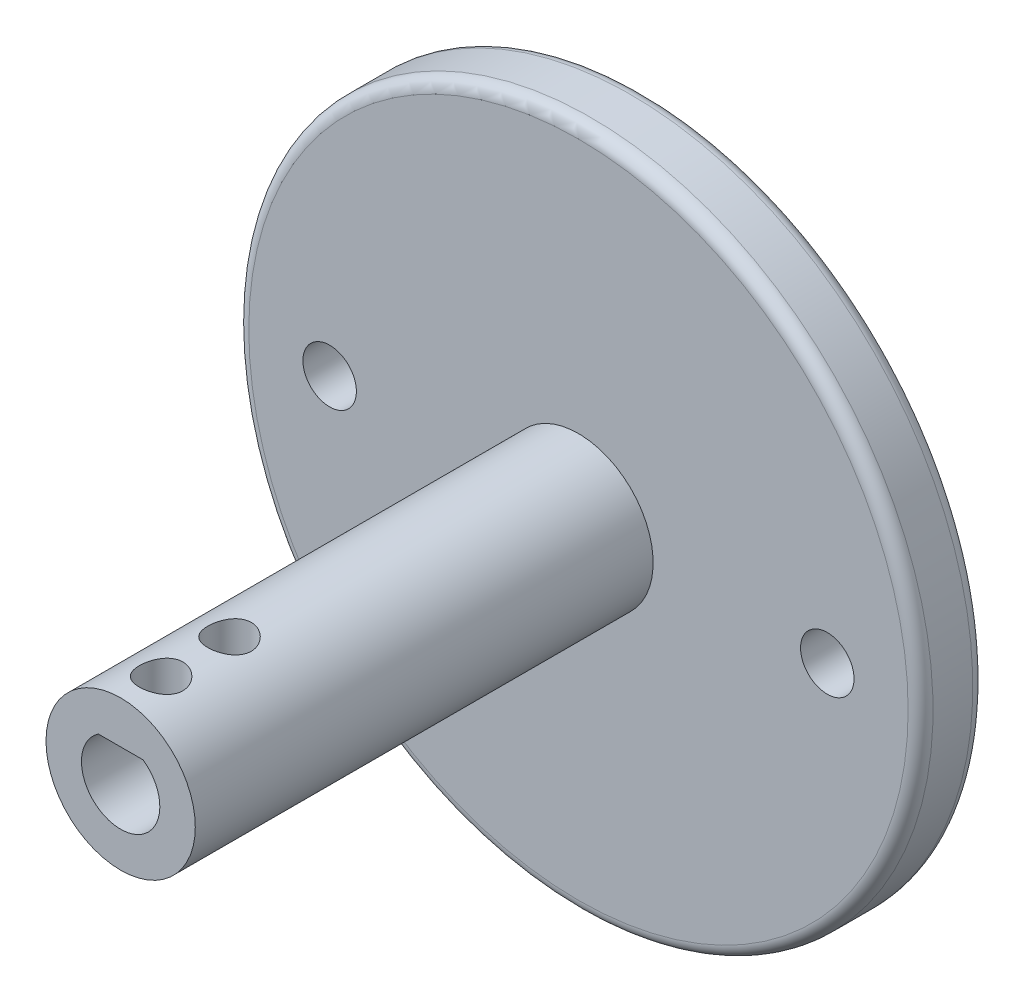
ISO-10303-21;
HEADER;
FILE_DESCRIPTION(('STEP AP214'),'2;1');
FILE_NAME('part.step','',(''),(''),'','','');
FILE_SCHEMA(('AUTOMOTIVE_DESIGN { 1 0 10303 214 1 1 1 1 }'));
ENDSEC;
DATA;
#1=APPLICATION_CONTEXT('core data for automotive mechanical design processes');
#2=APPLICATION_PROTOCOL_DEFINITION('international standard','automotive_design',2000,#1);
#3=PRODUCT_CONTEXT('',#1,'mechanical');
#4=PRODUCT('Part','Part','',(#3));
#5=PRODUCT_RELATED_PRODUCT_CATEGORY('part','',(#4));
#6=PRODUCT_DEFINITION_FORMATION('','',#4);
#7=PRODUCT_DEFINITION_CONTEXT('part definition',#1,'design');
#8=PRODUCT_DEFINITION('design','',#6,#7);
#9=PRODUCT_DEFINITION_SHAPE('','',#8);
#10=(LENGTH_UNIT() NAMED_UNIT(*) SI_UNIT(.MILLI.,.METRE.));
#11=(NAMED_UNIT(*) PLANE_ANGLE_UNIT() SI_UNIT($,.RADIAN.));
#12=(NAMED_UNIT(*) SI_UNIT($,.STERADIAN.) SOLID_ANGLE_UNIT());
#13=UNCERTAINTY_MEASURE_WITH_UNIT(LENGTH_MEASURE(1.E-05),#10,'distance_accuracy_value','');
#14=(GEOMETRIC_REPRESENTATION_CONTEXT(3) GLOBAL_UNCERTAINTY_ASSIGNED_CONTEXT((#13)) GLOBAL_UNIT_ASSIGNED_CONTEXT((#10,
#11,#12)) REPRESENTATION_CONTEXT('',''));
#15=CARTESIAN_POINT('',(0.,0.,0.));
#16=DIRECTION('',(0.,0.,1.));
#17=DIRECTION('',(1.,0.,0.));
#18=AXIS2_PLACEMENT_3D('',#15,#16,#17);
#19=CARTESIAN_POINT('',(0.,0.,3.2));
#20=DIRECTION('',(0.,0.,-1.));
#21=DIRECTION('',(-1.,0.,0.));
#22=AXIS2_PLACEMENT_3D('',#19,#20,#21);
#23=PLANE('',#22);
#24=CARTESIAN_POINT('',(0.,0.,3.2));
#25=DIRECTION('',(0.,0.,-1.));
#26=DIRECTION('',(-1.,0.,0.));
#27=AXIS2_PLACEMENT_3D('',#24,#25,#26);
#28=CIRCLE('',#27,26.5);
#29=CARTESIAN_POINT('',(-26.5,0.,3.2));
#30=VERTEX_POINT('',#29);
#31=EDGE_CURVE('E11',#30,#30,#28,.F.);
#32=ORIENTED_EDGE('',*,*,#31,.T.);
#33=EDGE_LOOP('',(#32));
#34=FACE_BOUND('',#33,.T.);
#35=CARTESIAN_POINT('',(-20.,0.,3.2));
#36=DIRECTION('',(0.,0.,1.));
#37=DIRECTION('',(1.,0.,0.));
#38=AXIS2_PLACEMENT_3D('',#35,#36,#37);
#39=CIRCLE('',#38,2.15);
#40=CARTESIAN_POINT('',(-17.85,0.,3.2));
#41=VERTEX_POINT('',#40);
#42=EDGE_CURVE('E128',#41,#41,#39,.T.);
#43=ORIENTED_EDGE('',*,*,#42,.F.);
#44=EDGE_LOOP('',(#43));
#45=FACE_BOUND('',#44,.T.);
#46=CARTESIAN_POINT('',(0.,0.,3.2));
#47=DIRECTION('',(0.,0.,-1.));
#48=DIRECTION('',(-1.,0.,0.));
#49=AXIS2_PLACEMENT_3D('',#46,#47,#48);
#50=CIRCLE('',#49,6.);
#51=CARTESIAN_POINT('',(-6.,0.,3.2));
#52=VERTEX_POINT('',#51);
#53=EDGE_CURVE('E68',#52,#52,#50,.T.);
#54=ORIENTED_EDGE('',*,*,#53,.T.);
#55=EDGE_LOOP('',(#54));
#56=FACE_BOUND('',#55,.T.);
#57=CARTESIAN_POINT('',(20.,0.,3.2));
#58=DIRECTION('',(0.,0.,-1.));
#59=DIRECTION('',(-1.,0.,0.));
#60=AXIS2_PLACEMENT_3D('',#57,#58,#59);
#61=CIRCLE('',#60,2.15);
#62=CARTESIAN_POINT('',(22.15,0.,3.2));
#63=VERTEX_POINT('',#62);
#64=EDGE_CURVE('E93',#63,#63,#61,.T.);
#65=ORIENTED_EDGE('',*,*,#64,.T.);
#66=EDGE_LOOP('',(#65));
#67=FACE_BOUND('',#66,.T.);
#68=ADVANCED_FACE('F39',(#34,#45,#56,#67),#23,.F.);
#69=CARTESIAN_POINT('',(0.,0.,-2.));
#70=DIRECTION('',(0.,0.,-1.));
#71=DIRECTION('',(-1.,0.,0.));
#72=AXIS2_PLACEMENT_3D('',#69,#70,#71);
#73=PLANE('',#72);
#74=CARTESIAN_POINT('',(0.,0.,-2.));
#75=DIRECTION('',(0.,0.,-1.));
#76=DIRECTION('',(-1.,0.,0.));
#77=AXIS2_PLACEMENT_3D('',#74,#75,#76);
#78=CIRCLE('',#77,26.5);
#79=CARTESIAN_POINT('',(-26.5,0.,-2.));
#80=VERTEX_POINT('',#79);
#81=EDGE_CURVE('E96',#80,#80,#78,.T.);
#82=ORIENTED_EDGE('',*,*,#81,.T.);
#83=EDGE_LOOP('',(#82));
#84=FACE_BOUND('',#83,.T.);
#85=CARTESIAN_POINT('',(-20.,0.,-2.));
#86=DIRECTION('',(0.,0.,-1.));
#87=DIRECTION('',(-1.,0.,0.));
#88=AXIS2_PLACEMENT_3D('',#85,#86,#87);
#89=CIRCLE('',#88,2.15);
#90=CARTESIAN_POINT('',(-17.85,0.,-2.));
#91=VERTEX_POINT('',#90);
#92=EDGE_CURVE('E90',#91,#91,#89,.T.);
#93=ORIENTED_EDGE('',*,*,#92,.F.);
#94=EDGE_LOOP('',(#93));
#95=FACE_BOUND('',#94,.T.);
#96=CARTESIAN_POINT('',(20.,0.,-2.));
#97=DIRECTION('',(0.,0.,-1.));
#98=DIRECTION('',(-1.,0.,0.));
#99=AXIS2_PLACEMENT_3D('',#96,#97,#98);
#100=CIRCLE('',#99,2.15);
#101=CARTESIAN_POINT('',(22.15,0.,-2.));
#102=VERTEX_POINT('',#101);
#103=EDGE_CURVE('E77',#102,#102,#100,.F.);
#104=ORIENTED_EDGE('',*,*,#103,.T.);
#105=EDGE_LOOP('',(#104));
#106=FACE_BOUND('',#105,.T.);
#107=ADVANCED_FACE('F113',(#84,#95,#106),#73,.T.);
#108=CARTESIAN_POINT('',(0.,0.,-2.));
#109=DIRECTION('',(0.,0.,1.));
#110=DIRECTION('',(1.,0.,0.));
#111=AXIS2_PLACEMENT_3D('',#108,#109,#110);
#112=CYLINDRICAL_SURFACE('',#111,27.5);
#113=CARTESIAN_POINT('',(0.,0.,-1.));
#114=DIRECTION('',(0.,0.,-1.));
#115=DIRECTION('',(-1.,0.,0.));
#116=AXIS2_PLACEMENT_3D('',#113,#114,#115);
#117=CIRCLE('',#116,27.5);
#118=CARTESIAN_POINT('',(-27.5,0.,-1.));
#119=VERTEX_POINT('',#118);
#120=EDGE_CURVE('E47',#119,#119,#117,.F.);
#121=ORIENTED_EDGE('',*,*,#120,.T.);
#122=EDGE_LOOP('',(#121));
#123=FACE_BOUND('',#122,.T.);
#124=CARTESIAN_POINT('',(0.,0.,2.2));
#125=DIRECTION('',(0.,0.,-1.));
#126=DIRECTION('',(-1.,0.,0.));
#127=AXIS2_PLACEMENT_3D('',#124,#125,#126);
#128=CIRCLE('',#127,27.5);
#129=CARTESIAN_POINT('',(-27.5,0.,2.2));
#130=VERTEX_POINT('',#129);
#131=EDGE_CURVE('E99',#130,#130,#128,.T.);
#132=ORIENTED_EDGE('',*,*,#131,.T.);
#133=EDGE_LOOP('',(#132));
#134=FACE_BOUND('',#133,.T.);
#135=ADVANCED_FACE('F104',(#123,#134),#112,.T.);
#136=CARTESIAN_POINT('',(0.,0.,40.));
#137=DIRECTION('',(0.,0.,-1.));
#138=DIRECTION('',(-1.,0.,0.));
#139=AXIS2_PLACEMENT_3D('',#136,#137,#138);
#140=CYLINDRICAL_SURFACE('',#139,6.);
#141=CARTESIAN_POINT('',(1.75,5.7391201416245,36.75));
#142=CARTESIAN_POINT('',(1.74999848143229,5.73912135233218,36.6539728400445));
#143=CARTESIAN_POINT('',(1.74206920201931,5.74155660684103,36.5579305055522));
#144=CARTESIAN_POINT('',(1.71063758772276,5.75099819259011,36.3686448445294));
#145=CARTESIAN_POINT('',(1.68712938820501,5.75800624523015,36.275402585901));
#146=CARTESIAN_POINT('',(1.62539891018832,5.77573366437414,36.0944840172599));
#147=CARTESIAN_POINT('',(1.58720010699206,5.78644710700006,36.0067990858153));
#148=CARTESIAN_POINT('',(1.49724903480251,5.8103702792937,35.8390626210443));
#149=CARTESIAN_POINT('',(1.44549498168001,5.82358033749983,35.7590120944445));
#150=CARTESIAN_POINT('',(1.32824554329379,5.8514513800029,35.606422359433));
#151=CARTESIAN_POINT('',(1.26241596701889,5.8661419700001,35.5341452913884));
#152=CARTESIAN_POINT('',(1.11960099692238,5.89506524619861,35.4014843796912));
#153=CARTESIAN_POINT('',(1.04261424727684,5.90929787649124,35.3411019835906));
#154=CARTESIAN_POINT('',(0.877817715970359,5.93603636207228,35.2328179523548));
#155=CARTESIAN_POINT('',(0.789826574692593,5.94850325436041,35.1851818652245));
#156=CARTESIAN_POINT('',(0.606657775834811,5.96996273194609,35.1054830851206));
#157=CARTESIAN_POINT('',(0.51148158370449,5.97895602343648,35.0734172263345));
#158=CARTESIAN_POINT('',(0.319385326415658,5.99224555879575,35.0266316598514));
#159=CARTESIAN_POINT('',(0.222582653190643,5.9966626309077,35.0114648906795));
#160=CARTESIAN_POINT('',(0.0277126943123472,6.0007267618746,34.9974962609768));
#161=CARTESIAN_POINT('',(-0.0703543359177026,6.00037476953799,34.998691145285));
#162=CARTESIAN_POINT('',(-0.261839339010209,5.99502665675503,35.0171079751208));
#163=CARTESIAN_POINT('',(-0.355308373260204,5.99017073825665,35.0338460964522));
#164=CARTESIAN_POINT('',(-0.53804812631703,5.97652948220135,35.082086208461));
#165=CARTESIAN_POINT('',(-0.62731858478134,5.96774390133059,35.1135891133388));
#166=CARTESIAN_POINT('',(-0.800299191226944,5.94703299959619,35.1908031746935));
#167=CARTESIAN_POINT('',(-0.883935598008259,5.93507351157704,35.2366699896403));
#168=CARTESIAN_POINT('',(-1.04248200075496,5.9092886595426,35.3411877761099));
#169=CARTESIAN_POINT('',(-1.11739001252847,5.89546287280477,35.3998416457974));
#170=CARTESIAN_POINT('',(-1.25924141940852,5.86683410672761,35.5307936657275));
#171=CARTESIAN_POINT('',(-1.32579407024835,5.85201387983932,35.603511857527));
#172=CARTESIAN_POINT('',(-1.44586660191142,5.82351168097608,35.7592242096615));
#173=CARTESIAN_POINT('',(-1.49938533073701,5.8098298096845,35.8422192773366));
#174=CARTESIAN_POINT('',(-1.59224878530753,5.78507419356831,36.0171103859865));
#175=CARTESIAN_POINT('',(-1.63146726373796,5.77402396450966,36.1090770313439));
#176=CARTESIAN_POINT('',(-1.69374851164605,5.75606450322795,36.2987050181475));
#177=CARTESIAN_POINT('',(-1.71681621402542,5.74915400670723,36.3963646109267));
#178=CARTESIAN_POINT('',(-1.7454256721976,5.74053185916609,36.5909039171708));
#179=CARTESIAN_POINT('',(-1.75155853244336,5.73864494944326,36.6876890121158));
#180=CARTESIAN_POINT('',(-1.74776921645585,5.73980029830615,36.8809062242058));
#181=CARTESIAN_POINT('',(-1.73784914220432,5.74284191154791,36.977338385907));
#182=CARTESIAN_POINT('',(-1.70276068513147,5.75334026618617,37.1646968319157));
#183=CARTESIAN_POINT('',(-1.67796628113718,5.76068862380037,37.2556998388729));
#184=CARTESIAN_POINT('',(-1.61426316316258,5.77886185683533,37.4322501967358));
#185=CARTESIAN_POINT('',(-1.57535235284098,5.7896872485818,37.517796735115));
#186=CARTESIAN_POINT('',(-1.48337952129907,5.81393978491672,37.6834278540094));
#187=CARTESIAN_POINT('',(-1.42998054711139,5.82742647058964,37.7633163968291));
#188=CARTESIAN_POINT('',(-1.31095181227824,5.85535101590732,37.9132152025272));
#189=CARTESIAN_POINT('',(-1.24531928682212,5.86978909009026,37.9832232260886));
#190=CARTESIAN_POINT('',(-1.10091901276198,5.89860806740746,38.113924651428));
#191=CARTESIAN_POINT('',(-1.02176859620354,5.91296886248222,38.1742007035104));
#192=CARTESIAN_POINT('',(-0.854138226573402,5.93949812101069,38.2806213880092));
#193=CARTESIAN_POINT('',(-0.765658753335446,5.95166669713258,38.3267667467522));
#194=CARTESIAN_POINT('',(-0.582484879123578,5.97236405546361,38.40317278485));
#195=CARTESIAN_POINT('',(-0.487843729255377,5.98092021102961,38.4335533409956));
#196=CARTESIAN_POINT('',(-0.294506890790342,5.99354961087299,38.4778873386253));
#197=CARTESIAN_POINT('',(-0.195812300452471,5.99762406124125,38.4918451997619));
#198=CARTESIAN_POINT('',(-0.00103743961966826,6.00076178273783,38.5026165757494));
#199=CARTESIAN_POINT('',(0.0950068407311645,6.00000245868248,38.5000370071742));
#200=CARTESIAN_POINT('',(0.285235716014245,5.99397167828825,38.4792467694297));
#201=CARTESIAN_POINT('',(0.379420406364285,5.98870045407916,38.4610369044133));
#202=CARTESIAN_POINT('',(0.562376479895314,5.97428492757917,38.4098708976204));
#203=CARTESIAN_POINT('',(0.651191371275255,5.96517853614574,38.3770589232695));
#204=CARTESIAN_POINT('',(0.822103394195297,5.94403648997228,38.2977485567586));
#205=CARTESIAN_POINT('',(0.904199455348199,5.93200036970177,38.2512479892512));
#206=CARTESIAN_POINT('',(1.06207963183778,5.90580993303637,38.1442234518342));
#207=CARTESIAN_POINT('',(1.13759275881333,5.89160195176128,38.0833129502602));
#208=CARTESIAN_POINT('',(1.27752965774599,5.86285183048808,37.9499031310895));
#209=CARTESIAN_POINT('',(1.34195030269254,5.84830959756853,37.8774005567182));
#210=CARTESIAN_POINT('',(1.45966022673122,5.82006568044674,37.7204520441067));
#211=CARTESIAN_POINT('',(1.51259163845184,5.80639844866528,37.6357308516903));
#212=CARTESIAN_POINT('',(1.60339388987167,5.78198514023874,37.4582058465362));
#213=CARTESIAN_POINT('',(1.64127267603194,5.77123752324486,37.365406330071));
#214=CARTESIAN_POINT('',(1.69707126506049,5.75505738666475,37.1860728498721));
#215=CARTESIAN_POINT('',(1.71686706269423,5.74913519026072,37.1001630620515));
#216=CARTESIAN_POINT('',(1.74333098170632,5.74116635043196,36.9261728520813));
#217=CARTESIAN_POINT('',(1.7500013930944,5.73911903095286,36.8380928112952));
#218=CARTESIAN_POINT('',(1.75,5.7391201416245,36.75));
#219=B_SPLINE_CURVE_WITH_KNOTS('',3,(#141,#142,#143,#144,#145,#146,#147,#148,#149,#150,#151,
#152,#153,#154,#155,#156,#157,#158,#159,#160,#161,#162,#163,#164,#165,#166,#167,#168,#169,#170,
#171,#172,#173,#174,#175,#176,#177,#178,#179,#180,#181,#182,#183,#184,#185,#186,#187,#188,#189,
#190,#191,#192,#193,#194,#195,#196,#197,#198,#199,#200,#201,#202,#203,#204,#205,#206,#207,#208,
#209,#210,#211,#212,#213,#214,#215,#216,#217,#218),.UNSPECIFIED.,.T.,.F.,(4,2,2,2,2,2,2,2,2,2,2,
2,2,2,2,2,2,2,2,2,2,2,2,2,2,2,2,2,2,2,2,2,2,2,2,2,2,2,4),(0.,0.287756797222528,
0.575621981143361,0.863029060661793,1.15047398745512,1.44570366788229,1.74096925486194,
2.04197684943756,2.3429232160698,2.63570371118683,2.92842595829134,3.21233131865285,
3.49625426008392,3.78336718563482,4.07054525263202,4.36821044004191,4.66590192692268,
4.96616130350708,5.26632893237126,5.55587830513258,5.84538976717713,6.12791051105675,
6.41047322755236,6.7002737922402,6.99013993210847,7.29026491272894,7.59037446414681,
7.8881672241191,8.18587982418321,8.47273065365001,8.7595667260038,9.04363159851128,
9.3277416380938,9.62056977394218,9.91348032442505,10.2145064741218,10.5153734967277,
10.7794001445159,11.0433807230145),.UNSPECIFIED.);
#220=CARTESIAN_POINT('',(1.75,5.7391201416245,36.75));
#221=VERTEX_POINT('',#220);
#222=EDGE_CURVE('E148',#221,#221,#219,.T.);
#223=ORIENTED_EDGE('',*,*,#222,.F.);
#224=EDGE_LOOP('',(#223));
#225=FACE_BOUND('',#224,.T.);
#226=CARTESIAN_POINT('',(1.75,5.7391201416245,31.25));
#227=CARTESIAN_POINT('',(1.74999848143229,5.73912135233217,31.1539728400445));
#228=CARTESIAN_POINT('',(1.74206920201931,5.74155660684103,31.0579305055522));
#229=CARTESIAN_POINT('',(1.71063758772276,5.75099819259011,30.8686448445294));
#230=CARTESIAN_POINT('',(1.68712938820501,5.75800624523015,30.775402585901));
#231=CARTESIAN_POINT('',(1.62539891018832,5.77573366437414,30.5944840172599));
#232=CARTESIAN_POINT('',(1.58720010699206,5.78644710700006,30.5067990858153));
#233=CARTESIAN_POINT('',(1.49724903480251,5.8103702792937,30.3390626210443));
#234=CARTESIAN_POINT('',(1.44549498168001,5.82358033749983,30.2590120944445));
#235=CARTESIAN_POINT('',(1.32824554329379,5.8514513800029,30.106422359433));
#236=CARTESIAN_POINT('',(1.26241596701889,5.8661419700001,30.0341452913884));
#237=CARTESIAN_POINT('',(1.11960099692238,5.89506524619861,29.9014843796912));
#238=CARTESIAN_POINT('',(1.04261424727684,5.90929787649124,29.8411019835906));
#239=CARTESIAN_POINT('',(0.877817715970356,5.93603636207228,29.7328179523548));
#240=CARTESIAN_POINT('',(0.78982657469259,5.94850325436041,29.6851818652245));
#241=CARTESIAN_POINT('',(0.606657775834807,5.96996273194609,29.6054830851206));
#242=CARTESIAN_POINT('',(0.511481583704486,5.97895602343648,29.5734172263344));
#243=CARTESIAN_POINT('',(0.319385326415653,5.99224555879575,29.5266316598514));
#244=CARTESIAN_POINT('',(0.222582653190639,5.9966626309077,29.5114648906795));
#245=CARTESIAN_POINT('',(0.0277126943123445,6.0007267618746,29.4974962609768));
#246=CARTESIAN_POINT('',(-0.0703543359177046,6.00037476953799,29.4986911452849));
#247=CARTESIAN_POINT('',(-0.26183933901021,5.99502665675503,29.5171079751208));
#248=CARTESIAN_POINT('',(-0.355308373260205,5.99017073825665,29.5338460964522));
#249=CARTESIAN_POINT('',(-0.538048126317032,5.97652948220135,29.582086208461));
#250=CARTESIAN_POINT('',(-0.627318584781341,5.96774390133058,29.6135891133387));
#251=CARTESIAN_POINT('',(-0.800299191226946,5.94703299959619,29.6908031746935));
#252=CARTESIAN_POINT('',(-0.883935598008262,5.93507351157704,29.7366699896403));
#253=CARTESIAN_POINT('',(-1.04248200075496,5.9092886595426,29.8411877761099));
#254=CARTESIAN_POINT('',(-1.11739001252847,5.89546287280477,29.8998416457974));
#255=CARTESIAN_POINT('',(-1.25924141940853,5.86683410672761,30.0307936657275));
#256=CARTESIAN_POINT('',(-1.32579407024835,5.85201387983932,30.103511857527));
#257=CARTESIAN_POINT('',(-1.44586660191142,5.82351168097608,30.2592242096615));
#258=CARTESIAN_POINT('',(-1.49938533073701,5.8098298096845,30.3422192773366));
#259=CARTESIAN_POINT('',(-1.59224878530754,5.78507419356831,30.5171103859865));
#260=CARTESIAN_POINT('',(-1.63146726373797,5.77402396450966,30.6090770313439));
#261=CARTESIAN_POINT('',(-1.69374851164605,5.75606450322795,30.7987050181475));
#262=CARTESIAN_POINT('',(-1.71681621402542,5.74915400670723,30.8963646109267));
#263=CARTESIAN_POINT('',(-1.7454256721976,5.74053185916609,31.0909039171708));
#264=CARTESIAN_POINT('',(-1.75155853244336,5.73864494944326,31.1876890121158));
#265=CARTESIAN_POINT('',(-1.74776921645585,5.73980029830615,31.3809062242058));
#266=CARTESIAN_POINT('',(-1.73784914220432,5.74284191154791,31.477338385907));
#267=CARTESIAN_POINT('',(-1.70276068513147,5.75334026618617,31.6646968319157));
#268=CARTESIAN_POINT('',(-1.67796628113718,5.76068862380037,31.7556998388729));
#269=CARTESIAN_POINT('',(-1.61426316316258,5.77886185683533,31.9322501967358));
#270=CARTESIAN_POINT('',(-1.57535235284098,5.7896872485818,32.017796735115));
#271=CARTESIAN_POINT('',(-1.48337952129907,5.81393978491672,32.1834278540094));
#272=CARTESIAN_POINT('',(-1.42998054711139,5.82742647058964,32.2633163968291));
#273=CARTESIAN_POINT('',(-1.31095181227823,5.85535101590732,32.4132152025272));
#274=CARTESIAN_POINT('',(-1.24531928682211,5.86978909009026,32.4832232260886));
#275=CARTESIAN_POINT('',(-1.10091901276198,5.89860806740746,32.613924651428));
#276=CARTESIAN_POINT('',(-1.02176859620353,5.91296886248222,32.6742007035104));
#277=CARTESIAN_POINT('',(-0.854138226573397,5.93949812101069,32.7806213880092));
#278=CARTESIAN_POINT('',(-0.765658753335444,5.95166669713258,32.8267667467522));
#279=CARTESIAN_POINT('',(-0.582484879123577,5.97236405546361,32.90317278485));
#280=CARTESIAN_POINT('',(-0.487843729255375,5.98092021102961,32.9335533409956));
#281=CARTESIAN_POINT('',(-0.294506890790339,5.99354961087299,32.9778873386253));
#282=CARTESIAN_POINT('',(-0.195812300452467,5.99762406124125,32.9918451997619));
#283=CARTESIAN_POINT('',(-0.0010374396196633,6.00076178273783,33.0026165757494));
#284=CARTESIAN_POINT('',(0.0950068407311695,6.00000245868248,33.0000370071742));
#285=CARTESIAN_POINT('',(0.285235716014249,5.99397167828825,32.9792467694297));
#286=CARTESIAN_POINT('',(0.379420406364288,5.98870045407917,32.9610369044132));
#287=CARTESIAN_POINT('',(0.562376479895316,5.97428492757917,32.9098708976204));
#288=CARTESIAN_POINT('',(0.651191371275258,5.96517853614574,32.8770589232694));
#289=CARTESIAN_POINT('',(0.822103394195301,5.94403648997228,32.7977485567586));
#290=CARTESIAN_POINT('',(0.904199455348203,5.93200036970177,32.7512479892512));
#291=CARTESIAN_POINT('',(1.06207963183779,5.90580993303637,32.6442234518341));
#292=CARTESIAN_POINT('',(1.13759275881333,5.89160195176128,32.5833129502602));
#293=CARTESIAN_POINT('',(1.27752965774599,5.86285183048808,32.4499031310895));
#294=CARTESIAN_POINT('',(1.34195030269254,5.84830959756853,32.3774005567182));
#295=CARTESIAN_POINT('',(1.45966022673122,5.82006568044674,32.2204520441067));
#296=CARTESIAN_POINT('',(1.51259163845184,5.80639844866528,32.1357308516903));
#297=CARTESIAN_POINT('',(1.60339388987167,5.78198514023874,31.9582058465362));
#298=CARTESIAN_POINT('',(1.64127267603194,5.77123752324486,31.865406330071));
#299=CARTESIAN_POINT('',(1.69707126506049,5.75505738666475,31.6860728498721));
#300=CARTESIAN_POINT('',(1.71686706269423,5.74913519026072,31.6001630620515));
#301=CARTESIAN_POINT('',(1.74333098170632,5.74116635043196,31.4261728520813));
#302=CARTESIAN_POINT('',(1.7500013930944,5.73911903095286,31.3380928112952));
#303=CARTESIAN_POINT('',(1.75,5.7391201416245,31.25));
#304=B_SPLINE_CURVE_WITH_KNOTS('',3,(#226,#227,#228,#229,#230,#231,#232,#233,#234,#235,#236,
#237,#238,#239,#240,#241,#242,#243,#244,#245,#246,#247,#248,#249,#250,#251,#252,#253,#254,#255,
#256,#257,#258,#259,#260,#261,#262,#263,#264,#265,#266,#267,#268,#269,#270,#271,#272,#273,#274,
#275,#276,#277,#278,#279,#280,#281,#282,#283,#284,#285,#286,#287,#288,#289,#290,#291,#292,#293,
#294,#295,#296,#297,#298,#299,#300,#301,#302,#303),.UNSPECIFIED.,.T.,.F.,(4,2,2,2,2,2,2,2,2,2,2,
2,2,2,2,2,2,2,2,2,2,2,2,2,2,2,2,2,2,2,2,2,2,2,2,2,2,2,4),(0.,0.287756797222521,
0.575621981143365,0.863029060661801,1.15047398745513,1.44570366788229,1.74096925486194,
2.04197684943757,2.34292321606981,2.63570371118684,2.92842595829134,3.21233131865285,
3.49625426008392,3.78336718563482,4.07054525263203,4.36821044004192,4.66590192692269,
4.9661613035071,5.26632893237126,5.55587830513258,5.84538976717714,6.12791051105676,
6.41047322755237,6.70027379224021,6.99013993210848,7.29026491272894,7.59037446414681,
7.8881672241191,8.18587982418322,8.47273065365002,8.75956672600381,9.04363159851129,
9.3277416380938,9.62056977394218,9.91348032442505,10.2145064741218,10.5153734967277,
10.7794001445159,11.0433807230145),.UNSPECIFIED.);
#305=CARTESIAN_POINT('',(1.75,5.7391201416245,31.25));
#306=VERTEX_POINT('',#305);
#307=EDGE_CURVE('E138',#306,#306,#304,.T.);
#308=ORIENTED_EDGE('',*,*,#307,.F.);
#309=EDGE_LOOP('',(#308));
#310=FACE_BOUND('',#309,.T.);
#311=CARTESIAN_POINT('',(0.,0.,40.));
#312=DIRECTION('',(0.,0.,1.));
#313=DIRECTION('',(1.,0.,0.));
#314=AXIS2_PLACEMENT_3D('',#311,#312,#313);
#315=CIRCLE('',#314,6.);
#316=CARTESIAN_POINT('',(6.,0.,40.));
#317=VERTEX_POINT('',#316);
#318=EDGE_CURVE('E69',#317,#317,#315,.T.);
#319=ORIENTED_EDGE('',*,*,#318,.F.);
#320=EDGE_LOOP('',(#319));
#321=FACE_BOUND('',#320,.T.);
#322=ORIENTED_EDGE('',*,*,#53,.F.);
#323=EDGE_LOOP('',(#322));
#324=FACE_BOUND('',#323,.T.);
#325=ADVANCED_FACE('F153',(#225,#310,#321,#324),#140,.T.);
#326=CARTESIAN_POINT('',(0.,0.,40.));
#327=DIRECTION('',(0.,0.,-1.));
#328=DIRECTION('',(-1.,0.,0.));
#329=AXIS2_PLACEMENT_3D('',#326,#327,#328);
#330=CYLINDRICAL_SURFACE('',#329,3.15);
#331=DIRECTION('',(0.,0.,-1.));
#332=VECTOR('',#331,1.);
#333=CARTESIAN_POINT('',(1.8,2.58505319094211,40.));
#334=LINE('',#333,#332);
#335=CARTESIAN_POINT('',(1.8,2.58505319094211,40.));
#336=VERTEX_POINT('',#335);
#337=CARTESIAN_POINT('',(1.8,2.58505319094211,3.2));
#338=VERTEX_POINT('',#337);
#339=EDGE_CURVE('E60',#336,#338,#334,.T.);
#340=ORIENTED_EDGE('',*,*,#339,.T.);
#341=CARTESIAN_POINT('',(0.,0.,3.2));
#342=DIRECTION('',(0.,0.,-1.));
#343=DIRECTION('',(-1.,0.,0.));
#344=AXIS2_PLACEMENT_3D('',#341,#342,#343);
#345=CIRCLE('',#344,3.15);
#346=CARTESIAN_POINT('',(-1.8,2.58505319094211,3.2));
#347=VERTEX_POINT('',#346);
#348=EDGE_CURVE('E53',#338,#347,#345,.T.);
#349=ORIENTED_EDGE('',*,*,#348,.T.);
#350=DIRECTION('',(0.,0.,-1.));
#351=VECTOR('',#350,1.);
#352=CARTESIAN_POINT('',(-1.8,2.58505319094211,40.));
#353=LINE('',#352,#351);
#354=CARTESIAN_POINT('',(-1.8,2.58505319094211,40.));
#355=VERTEX_POINT('',#354);
#356=EDGE_CURVE('E74',#355,#347,#353,.T.);
#357=ORIENTED_EDGE('',*,*,#356,.F.);
#358=CARTESIAN_POINT('',(0.,0.,40.));
#359=DIRECTION('',(0.,0.,1.));
#360=DIRECTION('',(1.,0.,0.));
#361=AXIS2_PLACEMENT_3D('',#358,#359,#360);
#362=CIRCLE('',#361,3.15);
#363=EDGE_CURVE('E84',#355,#336,#362,.T.);
#364=ORIENTED_EDGE('',*,*,#363,.T.);
#365=EDGE_LOOP('',(#340,#349,#357,#364));
#366=FACE_BOUND('',#365,.T.);
#367=ADVANCED_FACE('F73',(#366),#330,.F.);
#368=CARTESIAN_POINT('',(-1.8,2.58505319094211,40.));
#369=DIRECTION('',(0.,-1.,0.));
#370=DIRECTION('',(1.,0.,0.));
#371=AXIS2_PLACEMENT_3D('',#368,#369,#370);
#372=PLANE('',#371);
#373=CARTESIAN_POINT('',(0.,2.58505319094211,36.75));
#374=DIRECTION('',(0.,1.,0.));
#375=DIRECTION('',(-1.,0.,0.));
#376=AXIS2_PLACEMENT_3D('',#373,#374,#375);
#377=CIRCLE('',#376,1.75);
#378=CARTESIAN_POINT('',(-1.75,2.58505319094211,36.75));
#379=VERTEX_POINT('',#378);
#380=EDGE_CURVE('E135',#379,#379,#377,.T.);
#381=ORIENTED_EDGE('',*,*,#380,.T.);
#382=EDGE_LOOP('',(#381));
#383=FACE_BOUND('',#382,.T.);
#384=CARTESIAN_POINT('',(0.,2.58505319094211,31.25));
#385=DIRECTION('',(0.,1.,0.));
#386=DIRECTION('',(-1.,0.,0.));
#387=AXIS2_PLACEMENT_3D('',#384,#385,#386);
#388=CIRCLE('',#387,1.75);
#389=CARTESIAN_POINT('',(-1.75,2.58505319094211,31.25));
#390=VERTEX_POINT('',#389);
#391=EDGE_CURVE('E76',#390,#390,#388,.T.);
#392=ORIENTED_EDGE('',*,*,#391,.T.);
#393=EDGE_LOOP('',(#392));
#394=FACE_BOUND('',#393,.T.);
#395=ORIENTED_EDGE('',*,*,#356,.T.);
#396=DIRECTION('',(1.,0.,0.));
#397=VECTOR('',#396,1.);
#398=CARTESIAN_POINT('',(-1.8,2.58505319094211,3.2));
#399=LINE('',#398,#397);
#400=EDGE_CURVE('E65',#347,#338,#399,.T.);
#401=ORIENTED_EDGE('',*,*,#400,.T.);
#402=ORIENTED_EDGE('',*,*,#339,.F.);
#403=DIRECTION('',(-1.,0.,0.));
#404=VECTOR('',#403,1.);
#405=CARTESIAN_POINT('',(-1.8,2.58505319094211,40.));
#406=LINE('',#405,#404);
#407=EDGE_CURVE('E81',#336,#355,#406,.T.);
#408=ORIENTED_EDGE('',*,*,#407,.T.);
#409=EDGE_LOOP('',(#395,#401,#402,#408));
#410=FACE_BOUND('',#409,.T.);
#411=ADVANCED_FACE('F79',(#383,#394,#410),#372,.T.);
#412=CARTESIAN_POINT('',(0.,0.,40.));
#413=DIRECTION('',(0.,0.,1.));
#414=DIRECTION('',(1.,0.,0.));
#415=AXIS2_PLACEMENT_3D('',#412,#413,#414);
#416=PLANE('',#415);
#417=ORIENTED_EDGE('',*,*,#318,.T.);
#418=EDGE_LOOP('',(#417));
#419=FACE_BOUND('',#418,.T.);
#420=ORIENTED_EDGE('',*,*,#407,.F.);
#421=ORIENTED_EDGE('',*,*,#363,.F.);
#422=EDGE_LOOP('',(#420,#421));
#423=FACE_BOUND('',#422,.T.);
#424=ADVANCED_FACE('F161',(#419,#423),#416,.T.);
#425=CARTESIAN_POINT('',(0.,10.0850531909421,31.25));
#426=DIRECTION('',(0.,-1.,0.));
#427=DIRECTION('',(1.,0.,0.));
#428=AXIS2_PLACEMENT_3D('',#425,#426,#427);
#429=CYLINDRICAL_SURFACE('',#428,1.75);
#430=ORIENTED_EDGE('',*,*,#391,.F.);
#431=EDGE_LOOP('',(#430));
#432=FACE_BOUND('',#431,.T.);
#433=ORIENTED_EDGE('',*,*,#307,.T.);
#434=EDGE_LOOP('',(#433));
#435=FACE_BOUND('',#434,.T.);
#436=ADVANCED_FACE('F156',(#432,#435),#429,.F.);
#437=CARTESIAN_POINT('',(0.,10.0850531909421,36.75));
#438=DIRECTION('',(0.,-1.,0.));
#439=DIRECTION('',(1.,0.,0.));
#440=AXIS2_PLACEMENT_3D('',#437,#438,#439);
#441=CYLINDRICAL_SURFACE('',#440,1.75);
#442=ORIENTED_EDGE('',*,*,#380,.F.);
#443=EDGE_LOOP('',(#442));
#444=FACE_BOUND('',#443,.T.);
#445=ORIENTED_EDGE('',*,*,#222,.T.);
#446=EDGE_LOOP('',(#445));
#447=FACE_BOUND('',#446,.T.);
#448=ADVANCED_FACE('F160',(#444,#447),#441,.F.);
#449=ORIENTED_EDGE('',*,*,#348,.F.);
#450=ORIENTED_EDGE('',*,*,#400,.F.);
#451=EDGE_LOOP('',(#449,#450));
#452=FACE_BOUND('',#451,.T.);
#453=ADVANCED_FACE('F66',(#452),#23,.F.);
#454=CARTESIAN_POINT('',(-20.,0.,-2.000012));
#455=DIRECTION('',(0.,0.,1.));
#456=DIRECTION('',(1.,0.,0.));
#457=AXIS2_PLACEMENT_3D('',#454,#455,#456);
#458=CYLINDRICAL_SURFACE('',#457,2.15);
#459=CARTESIAN_POINT('',(-17.85,0.,-2.));
#460=CARTESIAN_POINT('',(-17.85,0.,-1.94583333333333));
#461=CARTESIAN_POINT('',(-17.85,0.,-1.89166666666667));
#462=CARTESIAN_POINT('',(-17.85,0.,-1.78333333333333));
#463=CARTESIAN_POINT('',(-17.85,0.,-1.72916666666667));
#464=CARTESIAN_POINT('',(-17.85,0.,-1.62083333333333));
#465=CARTESIAN_POINT('',(-17.85,0.,-1.56666666666667));
#466=CARTESIAN_POINT('',(-17.85,0.,-1.45833333333333));
#467=CARTESIAN_POINT('',(-17.85,0.,-1.40416666666667));
#468=CARTESIAN_POINT('',(-17.85,0.,-1.29583333333333));
#469=CARTESIAN_POINT('',(-17.85,0.,-1.24166666666667));
#470=CARTESIAN_POINT('',(-17.85,0.,-1.13333333333333));
#471=CARTESIAN_POINT('',(-17.85,0.,-1.07916666666667));
#472=CARTESIAN_POINT('',(-17.85,0.,-0.970833333333333));
#473=CARTESIAN_POINT('',(-17.85,0.,-0.916666666666667));
#474=CARTESIAN_POINT('',(-17.85,0.,-0.808333333333333));
#475=CARTESIAN_POINT('',(-17.85,0.,-0.754166666666667));
#476=CARTESIAN_POINT('',(-17.85,0.,-0.645833333333333));
#477=CARTESIAN_POINT('',(-17.85,0.,-0.591666666666667));
#478=CARTESIAN_POINT('',(-17.85,0.,-0.483333333333334));
#479=CARTESIAN_POINT('',(-17.85,0.,-0.429166666666667));
#480=CARTESIAN_POINT('',(-17.85,0.,-0.320833333333333));
#481=CARTESIAN_POINT('',(-17.85,0.,-0.266666666666667));
#482=CARTESIAN_POINT('',(-17.85,0.,-0.158333333333333));
#483=CARTESIAN_POINT('',(-17.85,0.,-0.104166666666667));
#484=CARTESIAN_POINT('',(-17.85,0.,0.0041666666666665));
#485=CARTESIAN_POINT('',(-17.85,0.,0.0583333333333331));
#486=CARTESIAN_POINT('',(-17.85,0.,0.166666666666667));
#487=CARTESIAN_POINT('',(-17.85,0.,0.220833333333333));
#488=CARTESIAN_POINT('',(-17.85,0.,0.329166666666667));
#489=CARTESIAN_POINT('',(-17.85,0.,0.383333333333333));
#490=CARTESIAN_POINT('',(-17.85,0.,0.491666666666667));
#491=CARTESIAN_POINT('',(-17.85,0.,0.545833333333333));
#492=CARTESIAN_POINT('',(-17.85,0.,0.654166666666666));
#493=CARTESIAN_POINT('',(-17.85,0.,0.708333333333333));
#494=CARTESIAN_POINT('',(-17.85,0.,0.816666666666666));
#495=CARTESIAN_POINT('',(-17.85,0.,0.870833333333333));
#496=CARTESIAN_POINT('',(-17.85,0.,0.979166666666666));
#497=CARTESIAN_POINT('',(-17.85,0.,1.03333333333333));
#498=CARTESIAN_POINT('',(-17.85,0.,1.14166666666667));
#499=CARTESIAN_POINT('',(-17.85,0.,1.19583333333333));
#500=CARTESIAN_POINT('',(-17.85,0.,1.30416666666667));
#501=CARTESIAN_POINT('',(-17.85,0.,1.35833333333333));
#502=CARTESIAN_POINT('',(-17.85,0.,1.46666666666667));
#503=CARTESIAN_POINT('',(-17.85,0.,1.52083333333333));
#504=CARTESIAN_POINT('',(-17.85,0.,1.62916666666667));
#505=CARTESIAN_POINT('',(-17.85,0.,1.68333333333333));
#506=CARTESIAN_POINT('',(-17.85,0.,1.79166666666667));
#507=CARTESIAN_POINT('',(-17.85,0.,1.84583333333333));
#508=CARTESIAN_POINT('',(-17.85,0.,1.95416666666667));
#509=CARTESIAN_POINT('',(-17.85,0.,2.00833333333333));
#510=CARTESIAN_POINT('',(-17.85,0.,2.11666666666667));
#511=CARTESIAN_POINT('',(-17.85,0.,2.17083333333333));
#512=CARTESIAN_POINT('',(-17.85,0.,2.27916666666667));
#513=CARTESIAN_POINT('',(-17.85,0.,2.33333333333333));
#514=CARTESIAN_POINT('',(-17.85,0.,2.44166666666667));
#515=CARTESIAN_POINT('',(-17.85,0.,2.49583333333333));
#516=CARTESIAN_POINT('',(-17.85,0.,2.60416666666667));
#517=CARTESIAN_POINT('',(-17.85,0.,2.65833333333333));
#518=CARTESIAN_POINT('',(-17.85,0.,2.76666666666667));
#519=CARTESIAN_POINT('',(-17.85,0.,2.82083333333333));
#520=CARTESIAN_POINT('',(-17.85,0.,2.92916666666667));
#521=CARTESIAN_POINT('',(-17.85,0.,2.98333333333333));
#522=CARTESIAN_POINT('',(-17.85,0.,3.09166666666667));
#523=CARTESIAN_POINT('',(-17.85,0.,3.14583333333333));
#524=CARTESIAN_POINT('',(-17.85,0.,3.2));
#525=B_SPLINE_CURVE_WITH_KNOTS('',3,(#459,#460,#461,#462,#463,#464,#465,#466,#467,#468,#469,
#470,#471,#472,#473,#474,#475,#476,#477,#478,#479,#480,#481,#482,#483,#484,#485,#486,#487,#488,
#489,#490,#491,#492,#493,#494,#495,#496,#497,#498,#499,#500,#501,#502,#503,#504,#505,#506,#507,
#508,#509,#510,#511,#512,#513,#514,#515,#516,#517,#518,#519,#520,#521,#522,#523,#524),
.UNSPECIFIED.,.F.,.F.,(4,2,2,2,2,2,2,2,2,2,2,2,2,2,2,2,2,2,2,2,2,2,2,2,2,2,2,2,2,2,2,2,4),(0.,
0.1625,0.325,0.4875,0.65,0.8125,0.975,1.1375,1.3,1.4625,1.625,1.7875,1.95,2.1125,2.275,2.4375,
2.6,2.7625,2.925,3.0875,3.25,3.4125,3.575,3.7375,3.9,4.0625,4.225,4.3875,4.55,4.7125,4.875,
5.0375,5.2),.UNSPECIFIED.);
#526=EDGE_CURVE('BSEAM123',#91,#41,#525,.T.);
#527=ORIENTED_EDGE('',*,*,#92,.T.);
#528=ORIENTED_EDGE('',*,*,#42,.T.);
#529=ORIENTED_EDGE('',*,*,#526,.T.);
#530=ORIENTED_EDGE('',*,*,#526,.F.);
#531=EDGE_LOOP('',(#527,#529,#528,#530));
#532=FACE_BOUND('',#531,.T.);
#533=ADVANCED_FACE('F123',(#532),#458,.F.);
#534=CARTESIAN_POINT('',(20.,0.,-2.000012));
#535=DIRECTION('',(0.,0.,1.));
#536=DIRECTION('',(1.,0.,0.));
#537=AXIS2_PLACEMENT_3D('',#534,#535,#536);
#538=CYLINDRICAL_SURFACE('',#537,2.15);
#539=CARTESIAN_POINT('',(22.15,0.,-2.));
#540=CARTESIAN_POINT('',(22.15,0.,-1.94583333333333));
#541=CARTESIAN_POINT('',(22.15,0.,-1.89166666666667));
#542=CARTESIAN_POINT('',(22.15,0.,-1.78333333333333));
#543=CARTESIAN_POINT('',(22.15,0.,-1.72916666666667));
#544=CARTESIAN_POINT('',(22.15,0.,-1.62083333333333));
#545=CARTESIAN_POINT('',(22.15,0.,-1.56666666666667));
#546=CARTESIAN_POINT('',(22.15,0.,-1.45833333333333));
#547=CARTESIAN_POINT('',(22.15,0.,-1.40416666666667));
#548=CARTESIAN_POINT('',(22.15,0.,-1.29583333333333));
#549=CARTESIAN_POINT('',(22.15,0.,-1.24166666666667));
#550=CARTESIAN_POINT('',(22.15,0.,-1.13333333333333));
#551=CARTESIAN_POINT('',(22.15,0.,-1.07916666666667));
#552=CARTESIAN_POINT('',(22.15,0.,-0.970833333333333));
#553=CARTESIAN_POINT('',(22.15,0.,-0.916666666666667));
#554=CARTESIAN_POINT('',(22.15,0.,-0.808333333333333));
#555=CARTESIAN_POINT('',(22.15,0.,-0.754166666666667));
#556=CARTESIAN_POINT('',(22.15,0.,-0.645833333333333));
#557=CARTESIAN_POINT('',(22.15,0.,-0.591666666666667));
#558=CARTESIAN_POINT('',(22.15,0.,-0.483333333333334));
#559=CARTESIAN_POINT('',(22.15,0.,-0.429166666666667));
#560=CARTESIAN_POINT('',(22.15,0.,-0.320833333333333));
#561=CARTESIAN_POINT('',(22.15,0.,-0.266666666666667));
#562=CARTESIAN_POINT('',(22.15,0.,-0.158333333333333));
#563=CARTESIAN_POINT('',(22.15,0.,-0.104166666666667));
#564=CARTESIAN_POINT('',(22.15,0.,0.0041666666666665));
#565=CARTESIAN_POINT('',(22.15,0.,0.0583333333333331));
#566=CARTESIAN_POINT('',(22.15,0.,0.166666666666667));
#567=CARTESIAN_POINT('',(22.15,0.,0.220833333333333));
#568=CARTESIAN_POINT('',(22.15,0.,0.329166666666667));
#569=CARTESIAN_POINT('',(22.15,0.,0.383333333333333));
#570=CARTESIAN_POINT('',(22.15,0.,0.491666666666667));
#571=CARTESIAN_POINT('',(22.15,0.,0.545833333333333));
#572=CARTESIAN_POINT('',(22.15,0.,0.654166666666666));
#573=CARTESIAN_POINT('',(22.15,0.,0.708333333333333));
#574=CARTESIAN_POINT('',(22.15,0.,0.816666666666666));
#575=CARTESIAN_POINT('',(22.15,0.,0.870833333333333));
#576=CARTESIAN_POINT('',(22.15,0.,0.979166666666666));
#577=CARTESIAN_POINT('',(22.15,0.,1.03333333333333));
#578=CARTESIAN_POINT('',(22.15,0.,1.14166666666667));
#579=CARTESIAN_POINT('',(22.15,0.,1.19583333333333));
#580=CARTESIAN_POINT('',(22.15,0.,1.30416666666667));
#581=CARTESIAN_POINT('',(22.15,0.,1.35833333333333));
#582=CARTESIAN_POINT('',(22.15,0.,1.46666666666667));
#583=CARTESIAN_POINT('',(22.15,0.,1.52083333333333));
#584=CARTESIAN_POINT('',(22.15,0.,1.62916666666667));
#585=CARTESIAN_POINT('',(22.15,0.,1.68333333333333));
#586=CARTESIAN_POINT('',(22.15,0.,1.79166666666667));
#587=CARTESIAN_POINT('',(22.15,0.,1.84583333333333));
#588=CARTESIAN_POINT('',(22.15,0.,1.95416666666667));
#589=CARTESIAN_POINT('',(22.15,0.,2.00833333333333));
#590=CARTESIAN_POINT('',(22.15,0.,2.11666666666667));
#591=CARTESIAN_POINT('',(22.15,0.,2.17083333333333));
#592=CARTESIAN_POINT('',(22.15,0.,2.27916666666667));
#593=CARTESIAN_POINT('',(22.15,0.,2.33333333333333));
#594=CARTESIAN_POINT('',(22.15,0.,2.44166666666667));
#595=CARTESIAN_POINT('',(22.15,0.,2.49583333333333));
#596=CARTESIAN_POINT('',(22.15,0.,2.60416666666667));
#597=CARTESIAN_POINT('',(22.15,0.,2.65833333333333));
#598=CARTESIAN_POINT('',(22.15,0.,2.76666666666667));
#599=CARTESIAN_POINT('',(22.15,0.,2.82083333333333));
#600=CARTESIAN_POINT('',(22.15,0.,2.92916666666667));
#601=CARTESIAN_POINT('',(22.15,0.,2.98333333333333));
#602=CARTESIAN_POINT('',(22.15,0.,3.09166666666667));
#603=CARTESIAN_POINT('',(22.15,0.,3.14583333333333));
#604=CARTESIAN_POINT('',(22.15,0.,3.2));
#605=B_SPLINE_CURVE_WITH_KNOTS('',3,(#539,#540,#541,#542,#543,#544,#545,#546,#547,#548,#549,
#550,#551,#552,#553,#554,#555,#556,#557,#558,#559,#560,#561,#562,#563,#564,#565,#566,#567,#568,
#569,#570,#571,#572,#573,#574,#575,#576,#577,#578,#579,#580,#581,#582,#583,#584,#585,#586,#587,
#588,#589,#590,#591,#592,#593,#594,#595,#596,#597,#598,#599,#600,#601,#602,#603,#604),
.UNSPECIFIED.,.F.,.F.,(4,2,2,2,2,2,2,2,2,2,2,2,2,2,2,2,2,2,2,2,2,2,2,2,2,2,2,2,2,2,2,2,4),(0.,
0.1625,0.325,0.4875,0.65,0.8125,0.975,1.1375,1.3,1.4625,1.625,1.7875,1.95,2.1125,2.275,2.4375,
2.6,2.7625,2.925,3.0875,3.25,3.4125,3.575,3.7375,3.9,4.0625,4.225,4.3875,4.55,4.7125,4.875,
5.0375,5.2),.UNSPECIFIED.);
#606=EDGE_CURVE('BSEAM110',#102,#63,#605,.T.);
#607=ORIENTED_EDGE('',*,*,#103,.F.);
#608=ORIENTED_EDGE('',*,*,#64,.F.);
#609=ORIENTED_EDGE('',*,*,#606,.T.);
#610=ORIENTED_EDGE('',*,*,#606,.F.);
#611=EDGE_LOOP('',(#607,#609,#608,#610));
#612=FACE_BOUND('',#611,.T.);
#613=ADVANCED_FACE('F110',(#612),#538,.F.);
#614=CARTESIAN_POINT('',(0.,0.,-1.));
#615=DIRECTION('',(0.,0.,-1.));
#616=DIRECTION('',(-1.,0.,0.));
#617=AXIS2_PLACEMENT_3D('',#614,#615,#616);
#618=TOROIDAL_SURFACE('',#617,26.5,1.);
#619=ORIENTED_EDGE('',*,*,#120,.F.);
#620=EDGE_LOOP('',(#619));
#621=FACE_BOUND('',#620,.T.);
#622=ORIENTED_EDGE('',*,*,#81,.F.);
#623=EDGE_LOOP('',(#622));
#624=FACE_BOUND('',#623,.T.);
#625=ADVANCED_FACE('F107',(#621,#624),#618,.T.);
#626=CARTESIAN_POINT('',(0.,0.,2.2));
#627=DIRECTION('',(0.,0.,-1.));
#628=DIRECTION('',(-1.,0.,0.));
#629=AXIS2_PLACEMENT_3D('',#626,#627,#628);
#630=TOROIDAL_SURFACE('',#629,26.5,1.);
#631=ORIENTED_EDGE('',*,*,#31,.F.);
#632=EDGE_LOOP('',(#631));
#633=FACE_BOUND('',#632,.T.);
#634=ORIENTED_EDGE('',*,*,#131,.F.);
#635=EDGE_LOOP('',(#634));
#636=FACE_BOUND('',#635,.T.);
#637=ADVANCED_FACE('F41',(#633,#636),#630,.T.);
#638=CLOSED_SHELL('',(#68,#107,#135,#325,#367,#411,#424,#436,#448,#453,#533,#613,#625,#637));
#639=MANIFOLD_SOLID_BREP('B2',#638);
#640=ADVANCED_BREP_SHAPE_REPRESENTATION('',(#18,#639),#14);
#641=SHAPE_DEFINITION_REPRESENTATION(#9,#640);
ENDSEC;
END-ISO-10303-21;
